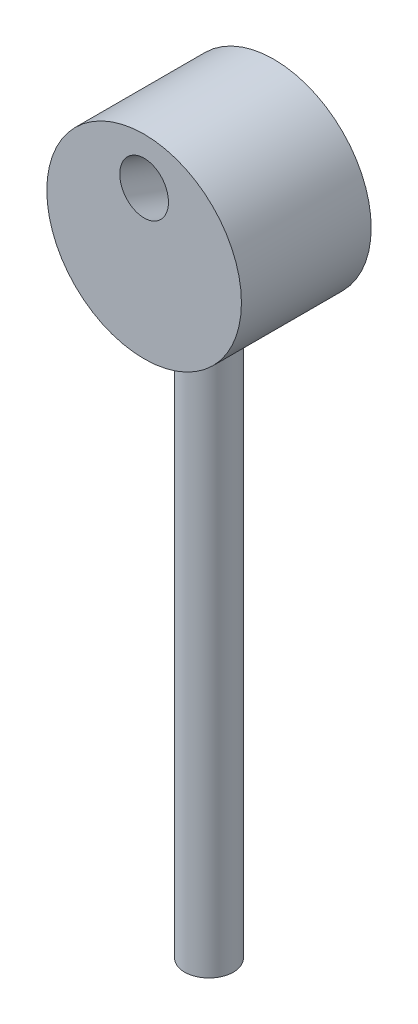
ISO-10303-21;
HEADER;
FILE_DESCRIPTION(('STEP AP214'),'2;1');
FILE_NAME('part.step','',(''),(''),'','','');
FILE_SCHEMA(('AUTOMOTIVE_DESIGN { 1 0 10303 214 1 1 1 1 }'));
ENDSEC;
DATA;
#1=APPLICATION_CONTEXT('core data for automotive mechanical design processes');
#2=APPLICATION_PROTOCOL_DEFINITION('international standard','automotive_design',2000,#1);
#3=PRODUCT_CONTEXT('',#1,'mechanical');
#4=PRODUCT('Part','Part','',(#3));
#5=PRODUCT_RELATED_PRODUCT_CATEGORY('part','',(#4));
#6=PRODUCT_DEFINITION_FORMATION('','',#4);
#7=PRODUCT_DEFINITION_CONTEXT('part definition',#1,'design');
#8=PRODUCT_DEFINITION('design','',#6,#7);
#9=PRODUCT_DEFINITION_SHAPE('','',#8);
#10=(LENGTH_UNIT() NAMED_UNIT(*) SI_UNIT(.MILLI.,.METRE.));
#11=(NAMED_UNIT(*) PLANE_ANGLE_UNIT() SI_UNIT($,.RADIAN.));
#12=(NAMED_UNIT(*) SI_UNIT($,.STERADIAN.) SOLID_ANGLE_UNIT());
#13=UNCERTAINTY_MEASURE_WITH_UNIT(LENGTH_MEASURE(1.E-05),#10,'distance_accuracy_value','');
#14=(GEOMETRIC_REPRESENTATION_CONTEXT(3) GLOBAL_UNCERTAINTY_ASSIGNED_CONTEXT((#13)) GLOBAL_UNIT_ASSIGNED_CONTEXT((#10,
#11,#12)) REPRESENTATION_CONTEXT('',''));
#15=CARTESIAN_POINT('',(0.,0.,0.));
#16=DIRECTION('',(0.,0.,1.));
#17=DIRECTION('',(1.,0.,0.));
#18=AXIS2_PLACEMENT_3D('',#15,#16,#17);
#19=CARTESIAN_POINT('',(0.,0.,1.));
#20=DIRECTION('',(0.,0.,-1.));
#21=DIRECTION('',(-1.,0.,0.));
#22=AXIS2_PLACEMENT_3D('',#19,#20,#21);
#23=CYLINDRICAL_SURFACE('',#22,1.5);
#24=CARTESIAN_POINT('',(0.,0.,1.));
#25=DIRECTION('',(0.,0.,1.));
#26=DIRECTION('',(1.,0.,0.));
#27=AXIS2_PLACEMENT_3D('',#24,#25,#26);
#28=CIRCLE('',#27,1.5);
#29=CARTESIAN_POINT('',(1.5,0.,1.));
#30=VERTEX_POINT('',#29);
#31=EDGE_CURVE('E46',#30,#30,#28,.T.);
#32=ORIENTED_EDGE('',*,*,#31,.F.);
#33=EDGE_LOOP('',(#32));
#34=FACE_BOUND('',#33,.T.);
#35=CARTESIAN_POINT('',(0.,0.,-1.));
#36=DIRECTION('',(0.,0.,1.));
#37=DIRECTION('',(1.,0.,0.));
#38=AXIS2_PLACEMENT_3D('',#35,#36,#37);
#39=CIRCLE('',#38,1.5);
#40=CARTESIAN_POINT('',(1.5,0.,-1.));
#41=VERTEX_POINT('',#40);
#42=EDGE_CURVE('E51',#41,#41,#39,.T.);
#43=ORIENTED_EDGE('',*,*,#42,.T.);
#44=EDGE_LOOP('',(#43));
#45=FACE_BOUND('',#44,.T.);
#46=CARTESIAN_POINT('',(0.,-1.5,-0.375));
#47=CARTESIAN_POINT('',(0.0207190221674328,-1.49999964967003,-0.37499941856546));
#48=CARTESIAN_POINT('',(0.0414445394576908,-1.49956644532957,-0.373277112306553));
#49=CARTESIAN_POINT('',(0.0823015809426332,-1.49788028457473,-0.366443712173249));
#50=CARTESIAN_POINT('',(0.102432761717685,-1.49662686354992,-0.361330697615538));
#51=CARTESIAN_POINT('',(0.141505218045644,-1.4934390658301,-0.347890186634478));
#52=CARTESIAN_POINT('',(0.160447890857501,-1.49150550710522,-0.339566550321181));
#53=CARTESIAN_POINT('',(0.196668032976107,-1.48716335951898,-0.319954652488792));
#54=CARTESIAN_POINT('',(0.21394544608719,-1.48475475463513,-0.308666290970266));
#55=CARTESIAN_POINT('',(0.24670048182523,-1.4796685339795,-0.283199802586447));
#56=CARTESIAN_POINT('',(0.262138922515268,-1.47698676787133,-0.268972106260205));
#57=CARTESIAN_POINT('',(0.290437231800826,-1.47168405029382,-0.238136948772771));
#58=CARTESIAN_POINT('',(0.303296809237284,-1.46906310572087,-0.221529219263376));
#59=CARTESIAN_POINT('',(0.326256635699758,-1.46413693924928,-0.186101193315641));
#60=CARTESIAN_POINT('',(0.336313053981339,-1.46183698617651,-0.167251692297399));
#61=CARTESIAN_POINT('',(0.353099227137632,-1.45787373703056,-0.12806289708541));
#62=CARTESIAN_POINT('',(0.359829513859833,-1.45621033918197,-0.107723841668559));
#63=CARTESIAN_POINT('',(0.369638709201073,-1.45375119179388,-0.0665641254493812));
#64=CARTESIAN_POINT('',(0.372788067083335,-1.45293872768857,-0.0457612759875499));
#65=CARTESIAN_POINT('',(0.375565443766963,-1.45222340634435,-0.0039078577465044));
#66=CARTESIAN_POINT('',(0.375194035454495,-1.45232040112161,0.0171426701746529));
#67=CARTESIAN_POINT('',(0.37099663115982,-1.45339801374155,0.0583539519361205));
#68=CARTESIAN_POINT('',(0.36725458504763,-1.4543571575047,0.0785239053662743));
#69=CARTESIAN_POINT('',(0.356556046725777,-1.45701677419121,0.117940262727823));
#70=CARTESIAN_POINT('',(0.349599325517356,-1.45871729992674,0.137186600757246));
#71=CARTESIAN_POINT('',(0.332597369484289,-1.46268778476047,0.174434504063017));
#72=CARTESIAN_POINT('',(0.322521666808228,-1.46496331867355,0.192421542947388));
#73=CARTESIAN_POINT('',(0.299589069003739,-1.46982427711596,0.226479677439209));
#74=CARTESIAN_POINT('',(0.28673168720221,-1.47240975583684,0.242550437016814));
#75=CARTESIAN_POINT('',(0.258165856170304,-1.47768970134945,0.2728009039236));
#76=CARTESIAN_POINT('',(0.242386564541465,-1.48038517369493,0.286913622515337));
#77=CARTESIAN_POINT('',(0.208652979375925,-1.48551491394696,0.312305310615976));
#78=CARTESIAN_POINT('',(0.190698619426986,-1.48794917387354,0.323584193565891));
#79=CARTESIAN_POINT('',(0.153028972170348,-1.49229433023546,0.343012646556096));
#80=CARTESIAN_POINT('',(0.133307848302156,-1.49420340031931,0.351151335063607));
#81=CARTESIAN_POINT('',(0.0927190020357207,-1.49726979247855,0.363979326427393));
#82=CARTESIAN_POINT('',(0.0718514997876212,-1.4984272583482,0.368669289104535));
#83=CARTESIAN_POINT('',(0.0301349925975066,-1.49983874817844,0.37436439138971));
#84=CARTESIAN_POINT('',(0.00929917999705229,-1.5001151337707,0.375460756518825));
#85=CARTESIAN_POINT('',(-0.0322582187003771,-1.49979701203613,0.374187749486128));
#86=CARTESIAN_POINT('',(-0.0529798149111488,-1.49920258310462,0.371818689300217));
#87=CARTESIAN_POINT('',(-0.093403567194123,-1.49722395281839,0.363757272902155));
#88=CARTESIAN_POINT('',(-0.113116279742189,-1.49585158546453,0.358114684130753));
#89=CARTESIAN_POINT('',(-0.151314323113128,-1.49247176658533,0.343723228992888));
#90=CARTESIAN_POINT('',(-0.169799529758159,-1.49046425092473,0.334974048921707));
#91=CARTESIAN_POINT('',(-0.205380783607462,-1.48598326981578,0.314440967781318));
#92=CARTESIAN_POINT('',(-0.222446360458958,-1.48350216841733,0.302605971900809));
#93=CARTESIAN_POINT('',(-0.254381653410812,-1.47836127296855,0.276302522800757));
#94=CARTESIAN_POINT('',(-0.269250989743252,-1.47570144812926,0.261833615095773));
#95=CARTESIAN_POINT('',(-0.296747642018183,-1.47042239240193,0.230249509788884));
#96=CARTESIAN_POINT('',(-0.309310966905508,-1.4678057604682,0.213078074249394));
#97=CARTESIAN_POINT('',(-0.331377689753174,-1.4629821959431,0.176816841383571));
#98=CARTESIAN_POINT('',(-0.340881223539484,-1.46077524516757,0.157727129260062));
#99=CARTESIAN_POINT('',(-0.356487855152323,-1.45704523683666,0.11827356939673));
#100=CARTESIAN_POINT('',(-0.362611099163516,-1.45551813822976,0.0979180929139977));
#101=CARTESIAN_POINT('',(-0.371336414988445,-1.45331686022546,0.0564225905277227));
#102=CARTESIAN_POINT('',(-0.373939256869664,-1.45264249429984,0.0352827372418772));
#103=CARTESIAN_POINT('',(-0.375509647583499,-1.45223725300989,-0.00653025596380078));
#104=CARTESIAN_POINT('',(-0.37457947444503,-1.45247983182066,-0.0271993587811828));
#105=CARTESIAN_POINT('',(-0.369344319578217,-1.45381977251961,-0.0680759721669954));
#106=CARTESIAN_POINT('',(-0.365039405671692,-1.45491711722964,-0.0882834920034127));
#107=CARTESIAN_POINT('',(-0.353232829860699,-1.45782815170681,-0.127552114766352));
#108=CARTESIAN_POINT('',(-0.345750351170094,-1.45963753809077,-0.146619326310052));
#109=CARTESIAN_POINT('',(-0.327816228401268,-1.46376938931207,-0.183241345678422));
#110=CARTESIAN_POINT('',(-0.317364172508547,-1.46609192530193,-0.200795943296729));
#111=CARTESIAN_POINT('',(-0.293466937159284,-1.47106408565878,-0.234388657250505));
#112=CARTESIAN_POINT('',(-0.279950790728064,-1.47372066207939,-0.25037526835599));
#113=CARTESIAN_POINT('',(-0.250447342797434,-1.47902006811571,-0.279886761198852));
#114=CARTESIAN_POINT('',(-0.234459455315286,-1.48166289431765,-0.293411057528242));
#115=CARTESIAN_POINT('',(-0.200116896675647,-1.48669413911916,-0.317852827141152));
#116=CARTESIAN_POINT('',(-0.181724605579097,-1.48907708341467,-0.328718653417895));
#117=CARTESIAN_POINT('',(-0.143316514877619,-1.4932623124378,-0.347186865735133));
#118=CARTESIAN_POINT('',(-0.123301890859185,-1.49506501299945,-0.354791590162134));
#119=CARTESIAN_POINT('',(-0.086102563310868,-1.49762014891385,-0.365392957582413));
#120=CARTESIAN_POINT('',(-0.0690950427270172,-1.49850646263173,-0.368987810763358));
#121=CARTESIAN_POINT('',(-0.0347265178840708,-1.49969651307987,-0.373791485905485));
#122=CARTESIAN_POINT('',(-0.0173655403106541,-1.50000029362724,-0.375000487326325));
#123=CARTESIAN_POINT('',(0.,-1.5,-0.375));
#124=B_SPLINE_CURVE_WITH_KNOTS('',3,(#46,#47,#48,#49,#50,#51,#52,#53,#54,#55,#56,#57,#58,#59,
#60,#61,#62,#63,#64,#65,#66,#67,#68,#69,#70,#71,#72,#73,#74,#75,#76,#77,#78,#79,#80,#81,#82,#83,
#84,#85,#86,#87,#88,#89,#90,#91,#92,#93,#94,#95,#96,#97,#98,#99,#100,#101,#102,#103,#104,#105,
#106,#107,#108,#109,#110,#111,#112,#113,#114,#115,#116,#117,#118,#119,#120,#121,#122,#123),
.UNSPECIFIED.,.T.,.F.,(4,2,2,2,2,2,2,2,2,2,2,2,2,2,2,2,2,2,2,2,2,2,2,2,2,2,2,2,2,2,2,2,2,2,2,2,
2,2,4),(0.,0.0620934281179725,0.124222059440975,0.186276225571527,0.248332485042332,
0.311536088592848,0.374746823950155,0.438896618864517,0.503036152923421,0.565890737748576,
0.628735095281742,0.690056242517545,0.751381758665096,0.813326319684698,0.875281727090407,
0.939003752422548,1.00272772389562,1.06667057252278,1.13060118422161,1.19289577237319,
1.25518475278186,1.31655068628509,1.37792281830573,1.44038396891338,1.50285590752005,
1.56686127301119,1.63086379687377,1.69448063653509,1.75808355813102,1.81985945099653,
1.88163410239009,1.94304100139862,2.00445642034225,2.06747394102478,2.13050642442604,
2.19468046374897,2.25880840955337,2.31085560735537,2.3628988901076),.UNSPECIFIED.);
#125=CARTESIAN_POINT('',(0.,-1.5,-0.375));
#126=VERTEX_POINT('',#125);
#127=EDGE_CURVE('E10',#126,#126,#124,.T.);
#128=ORIENTED_EDGE('',*,*,#127,.F.);
#129=EDGE_LOOP('',(#128));
#130=FACE_BOUND('',#129,.T.);
#131=ADVANCED_FACE('F37',(#34,#45,#130),#23,.T.);
#132=CARTESIAN_POINT('',(0.,0.,1.));
#133=DIRECTION('',(0.,0.,1.));
#134=DIRECTION('',(1.,0.,0.));
#135=AXIS2_PLACEMENT_3D('',#132,#133,#134);
#136=PLANE('',#135);
#137=CARTESIAN_POINT('',(0.,0.78,1.));
#138=DIRECTION('',(0.,0.,1.));
#139=DIRECTION('',(0.,-1.,0.));
#140=AXIS2_PLACEMENT_3D('',#137,#138,#139);
#141=ELLIPSE('',#140,0.399066664678467,0.375);
#142=CARTESIAN_POINT('',(0.,0.380933335321533,1.));
#143=VERTEX_POINT('',#142);
#144=EDGE_CURVE('E92',#143,#143,#141,.T.);
#145=ORIENTED_EDGE('',*,*,#144,.F.);
#146=EDGE_LOOP('',(#145));
#147=FACE_BOUND('',#146,.T.);
#148=ORIENTED_EDGE('',*,*,#31,.T.);
#149=EDGE_LOOP('',(#148));
#150=FACE_BOUND('',#149,.T.);
#151=ADVANCED_FACE('F68',(#147,#150),#136,.T.);
#152=CARTESIAN_POINT('',(0.,0.,-1.));
#153=DIRECTION('',(0.,0.,1.));
#154=DIRECTION('',(1.,0.,0.));
#155=AXIS2_PLACEMENT_3D('',#152,#153,#154);
#156=PLANE('',#155);
#157=CARTESIAN_POINT('',(0.,0.0520595314675936,-1.));
#158=DIRECTION('',(0.,0.,1.));
#159=DIRECTION('',(0.,-1.,0.));
#160=AXIS2_PLACEMENT_3D('',#157,#158,#159);
#161=ELLIPSE('',#160,0.399066664678467,0.375);
#162=CARTESIAN_POINT('',(0.,-0.347007133210874,-1.));
#163=VERTEX_POINT('',#162);
#164=EDGE_CURVE('E41',#163,#163,#161,.T.);
#165=ORIENTED_EDGE('',*,*,#164,.T.);
#166=EDGE_LOOP('',(#165));
#167=FACE_BOUND('',#166,.T.);
#168=ORIENTED_EDGE('',*,*,#42,.F.);
#169=EDGE_LOOP('',(#168));
#170=FACE_BOUND('',#169,.T.);
#171=ADVANCED_FACE('F66',(#167,#170),#156,.F.);
#172=CARTESIAN_POINT('',(0.,-10.,0.));
#173=DIRECTION('',(0.,1.,0.));
#174=DIRECTION('',(0.,0.,1.));
#175=AXIS2_PLACEMENT_3D('',#172,#173,#174);
#176=PLANE('',#175);
#177=CARTESIAN_POINT('',(0.,-10.,0.));
#178=DIRECTION('',(0.,1.,0.));
#179=DIRECTION('',(0.,0.,1.));
#180=AXIS2_PLACEMENT_3D('',#177,#178,#179);
#181=CIRCLE('',#180,0.375);
#182=CARTESIAN_POINT('',(0.,-10.,0.375));
#183=VERTEX_POINT('',#182);
#184=EDGE_CURVE('E89',#183,#183,#181,.T.);
#185=ORIENTED_EDGE('',*,*,#184,.F.);
#186=EDGE_LOOP('',(#185));
#187=FACE_BOUND('',#186,.T.);
#188=ADVANCED_FACE('F64',(#187),#176,.F.);
#189=CARTESIAN_POINT('',(0.,1.502,0.));
#190=DIRECTION('',(0.,-1.,0.));
#191=DIRECTION('',(0.,0.,-1.));
#192=AXIS2_PLACEMENT_3D('',#189,#190,#191);
#193=CYLINDRICAL_SURFACE('',#192,0.375);
#194=ORIENTED_EDGE('',*,*,#184,.T.);
#195=EDGE_LOOP('',(#194));
#196=FACE_BOUND('',#195,.T.);
#197=ORIENTED_EDGE('',*,*,#127,.T.);
#198=EDGE_LOOP('',(#197));
#199=FACE_BOUND('',#198,.T.);
#200=ADVANCED_FACE('F58',(#196,#199),#193,.T.);
#201=CARTESIAN_POINT('',(0.,2.49010071662835,5.69846310392954));
#202=DIRECTION('',(0.,-0.342020143325669,-0.939692620785908));
#203=DIRECTION('',(0.,0.939692620785908,-0.342020143325669));
#204=AXIS2_PLACEMENT_3D('',#201,#202,#203);
#205=CYLINDRICAL_SURFACE('',#204,0.375);
#206=ORIENTED_EDGE('',*,*,#144,.T.);
#207=EDGE_LOOP('',(#206));
#208=FACE_BOUND('',#207,.T.);
#209=ORIENTED_EDGE('',*,*,#164,.F.);
#210=EDGE_LOOP('',(#209));
#211=FACE_BOUND('',#210,.T.);
#212=ADVANCED_FACE('F63',(#208,#211),#205,.F.);
#213=CLOSED_SHELL('',(#131,#151,#171,#188,#200,#212));
#214=MANIFOLD_SOLID_BREP('B2',#213);
#215=ADVANCED_BREP_SHAPE_REPRESENTATION('',(#18,#214),#14);
#216=SHAPE_DEFINITION_REPRESENTATION(#9,#215);
ENDSEC;
END-ISO-10303-21;
